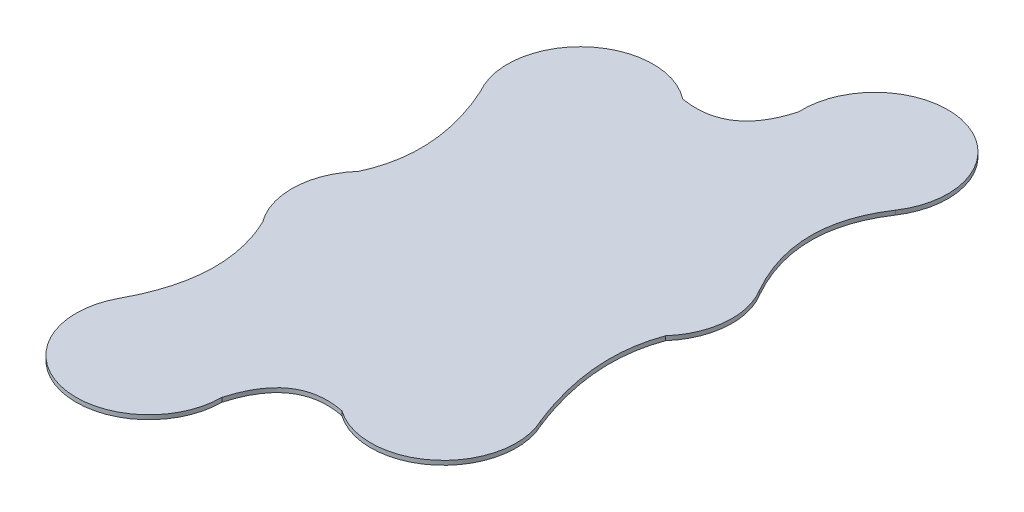
ISO-10303-21;
HEADER;
FILE_DESCRIPTION(('STEP AP214'),'2;1');
FILE_NAME('part.step','',(''),(''),'','','');
FILE_SCHEMA(('AUTOMOTIVE_DESIGN { 1 0 10303 214 1 1 1 1 }'));
ENDSEC;
DATA;
#1=APPLICATION_CONTEXT('core data for automotive mechanical design processes');
#2=APPLICATION_PROTOCOL_DEFINITION('international standard','automotive_design',2000,#1);
#3=PRODUCT_CONTEXT('',#1,'mechanical');
#4=PRODUCT('Part','Part','',(#3));
#5=PRODUCT_RELATED_PRODUCT_CATEGORY('part','',(#4));
#6=PRODUCT_DEFINITION_FORMATION('','',#4);
#7=PRODUCT_DEFINITION_CONTEXT('part definition',#1,'design');
#8=PRODUCT_DEFINITION('design','',#6,#7);
#9=PRODUCT_DEFINITION_SHAPE('','',#8);
#10=(LENGTH_UNIT() NAMED_UNIT(*) SI_UNIT(.MILLI.,.METRE.));
#11=(NAMED_UNIT(*) PLANE_ANGLE_UNIT() SI_UNIT($,.RADIAN.));
#12=(NAMED_UNIT(*) SI_UNIT($,.STERADIAN.) SOLID_ANGLE_UNIT());
#13=UNCERTAINTY_MEASURE_WITH_UNIT(LENGTH_MEASURE(1.E-05),#10,'distance_accuracy_value','');
#14=(GEOMETRIC_REPRESENTATION_CONTEXT(3) GLOBAL_UNCERTAINTY_ASSIGNED_CONTEXT((#13)) GLOBAL_UNIT_ASSIGNED_CONTEXT((#10,
#11,#12)) REPRESENTATION_CONTEXT('',''));
#15=CARTESIAN_POINT('',(0.,0.,0.));
#16=DIRECTION('',(0.,0.,1.));
#17=DIRECTION('',(1.,0.,0.));
#18=AXIS2_PLACEMENT_3D('',#15,#16,#17);
#19=CARTESIAN_POINT('',(-36.08378549757,0.5,43.4317480104097));
#20=CARTESIAN_POINT('',(-29.8316763102318,0.5,44.5112367383915));
#21=CARTESIAN_POINT('',(-28.0268993987834,0.5,37.9831700790291));
#22=B_SPLINE_CURVE_WITH_KNOTS('',2,(#19,#20,#21),.UNSPECIFIED.,.F.,.F.,(3,3),(0.,1.),.UNSPECIFIED.);
#23=DIRECTION('',(0.,-1.,0.));
#24=VECTOR('',#23,1.);
#25=SURFACE_OF_LINEAR_EXTRUSION('',#22,#24);
#26=CARTESIAN_POINT('',(-36.08378549757,0.,43.4317480104097));
#27=CARTESIAN_POINT('',(-29.8316763102318,0.,44.5112367383915));
#28=CARTESIAN_POINT('',(-28.0268993987834,0.,37.9831700790291));
#29=B_SPLINE_CURVE_WITH_KNOTS('',2,(#26,#27,#28),.UNSPECIFIED.,.F.,.F.,(3,3),(0.,1.),.UNSPECIFIED.);
#30=CARTESIAN_POINT('',(-36.08378549757,0.,43.4317480104097));
#31=VERTEX_POINT('',#30);
#32=CARTESIAN_POINT('',(-28.0268993987834,0.,37.9831700790291));
#33=VERTEX_POINT('',#32);
#34=EDGE_CURVE('E254',#31,#33,#29,.T.);
#35=ORIENTED_EDGE('',*,*,#34,.F.);
#36=DIRECTION('',(0.,-1.,0.));
#37=VECTOR('',#36,1.);
#38=CARTESIAN_POINT('',(-36.08378549757,0.5,43.4317480104097));
#39=LINE('',#38,#37);
#40=CARTESIAN_POINT('',(-36.08378549757,0.5,43.4317480104097));
#41=VERTEX_POINT('',#40);
#42=EDGE_CURVE('E11',#41,#31,#39,.T.);
#43=ORIENTED_EDGE('',*,*,#42,.F.);
#44=CARTESIAN_POINT('',(-28.0268993987834,0.5,37.9831700790291));
#45=VERTEX_POINT('',#44);
#46=EDGE_CURVE('E313',#41,#45,#22,.T.);
#47=ORIENTED_EDGE('',*,*,#46,.T.);
#48=DIRECTION('',(0.,-1.,0.));
#49=VECTOR('',#48,1.);
#50=CARTESIAN_POINT('',(-28.0268993987834,0.5,37.9831700790291));
#51=LINE('',#50,#49);
#52=EDGE_CURVE('E47',#45,#33,#51,.T.);
#53=ORIENTED_EDGE('',*,*,#52,.T.);
#54=EDGE_LOOP('',(#35,#43,#47,#53));
#55=FACE_BOUND('',#54,.T.);
#56=ADVANCED_FACE('F43',(#55),#25,.T.);
#57=CARTESIAN_POINT('',(-41.3182919912712,0.5,50.1287579228557));
#58=DIRECTION('',(0.,-1.,0.));
#59=DIRECTION('',(0.,0.,-1.));
#60=AXIS2_PLACEMENT_3D('',#57,#58,#59);
#61=CYLINDRICAL_SURFACE('',#60,8.50000000000001);
#62=CARTESIAN_POINT('',(-41.3182919912712,0.,50.1287579228557));
#63=DIRECTION('',(0.,1.,0.));
#64=DIRECTION('',(0.,0.,1.));
#65=AXIS2_PLACEMENT_3D('',#62,#63,#64);
#66=CIRCLE('',#65,8.50000000000001);
#67=CARTESIAN_POINT('',(-48.6383932433718,0.,54.449188186035));
#68=VERTEX_POINT('',#67);
#69=EDGE_CURVE('E309',#31,#68,#66,.T.);
#70=ORIENTED_EDGE('',*,*,#69,.T.);
#71=DIRECTION('',(0.,-1.,0.));
#72=VECTOR('',#71,1.);
#73=CARTESIAN_POINT('',(-48.6383932433718,0.5,54.449188186035));
#74=LINE('',#73,#72);
#75=CARTESIAN_POINT('',(-48.6383932433718,0.5,54.449188186035));
#76=VERTEX_POINT('',#75);
#77=EDGE_CURVE('E53',#76,#68,#74,.T.);
#78=ORIENTED_EDGE('',*,*,#77,.F.);
#79=CARTESIAN_POINT('',(-41.3182919912712,0.5,50.1287579228557));
#80=DIRECTION('',(0.,1.,0.));
#81=DIRECTION('',(0.,0.,1.));
#82=AXIS2_PLACEMENT_3D('',#79,#80,#81);
#83=CIRCLE('',#82,8.50000000000001);
#84=EDGE_CURVE('E159',#41,#76,#83,.T.);
#85=ORIENTED_EDGE('',*,*,#84,.F.);
#86=ORIENTED_EDGE('',*,*,#42,.T.);
#87=EDGE_LOOP('',(#70,#78,#85,#86));
#88=FACE_BOUND('',#87,.T.);
#89=ADVANCED_FACE('F174',(#88),#61,.T.);
#90=CARTESIAN_POINT('',(-47.6612581002219,0.5,69.6204206281459));
#91=CARTESIAN_POINT('',(-44.6778630402518,0.5,63.1594739411177));
#92=CARTESIAN_POINT('',(-48.6383932433718,0.5,54.449188186035));
#93=B_SPLINE_CURVE_WITH_KNOTS('',2,(#90,#91,#92),.UNSPECIFIED.,.F.,.F.,(3,3),(0.,1.),.UNSPECIFIED.);
#94=DIRECTION('',(0.,-1.,0.));
#95=VECTOR('',#94,1.);
#96=SURFACE_OF_LINEAR_EXTRUSION('',#93,#95);
#97=CARTESIAN_POINT('',(-47.6612581002219,0.,69.6204206281459));
#98=CARTESIAN_POINT('',(-44.6778630402518,0.,63.1594739411177));
#99=CARTESIAN_POINT('',(-48.6383932433718,0.,54.449188186035));
#100=B_SPLINE_CURVE_WITH_KNOTS('',2,(#97,#98,#99),.UNSPECIFIED.,.F.,.F.,(3,3),(0.,1.),.UNSPECIFIED.);
#101=CARTESIAN_POINT('',(-47.6612581002219,0.,69.6204206281459));
#102=VERTEX_POINT('',#101);
#103=EDGE_CURVE('E145',#102,#68,#100,.T.);
#104=ORIENTED_EDGE('',*,*,#103,.F.);
#105=DIRECTION('',(0.,-1.,0.));
#106=VECTOR('',#105,1.);
#107=CARTESIAN_POINT('',(-47.6612581002219,0.5,69.6204206281459));
#108=LINE('',#107,#106);
#109=CARTESIAN_POINT('',(-47.6612581002219,0.5,69.6204206281459));
#110=VERTEX_POINT('',#109);
#111=EDGE_CURVE('E139',#110,#102,#108,.T.);
#112=ORIENTED_EDGE('',*,*,#111,.F.);
#113=EDGE_CURVE('E143',#110,#76,#93,.T.);
#114=ORIENTED_EDGE('',*,*,#113,.T.);
#115=ORIENTED_EDGE('',*,*,#77,.T.);
#116=EDGE_LOOP('',(#104,#112,#114,#115));
#117=FACE_BOUND('',#116,.T.);
#118=ADVANCED_FACE('F141',(#117),#96,.T.);
#119=CARTESIAN_POINT('',(-41.3182919912712,0.5,75.2787579228557));
#120=DIRECTION('',(0.,-1.,0.));
#121=DIRECTION('',(0.,0.,-1.));
#122=AXIS2_PLACEMENT_3D('',#119,#120,#121);
#123=CYLINDRICAL_SURFACE('',#122,8.50000000000001);
#124=CARTESIAN_POINT('',(-41.3182919912712,0.,75.2787579228557));
#125=DIRECTION('',(0.,1.,0.));
#126=DIRECTION('',(0.,0.,1.));
#127=AXIS2_PLACEMENT_3D('',#124,#125,#126);
#128=CIRCLE('',#127,8.50000000000001);
#129=CARTESIAN_POINT('',(-48.1377081598603,0.,80.3527665077504));
#130=VERTEX_POINT('',#129);
#131=EDGE_CURVE('E301',#102,#130,#128,.T.);
#132=ORIENTED_EDGE('',*,*,#131,.T.);
#133=DIRECTION('',(0.,-1.,0.));
#134=VECTOR('',#133,1.);
#135=CARTESIAN_POINT('',(-48.1377081598603,0.5,80.3527665077504));
#136=LINE('',#135,#134);
#137=CARTESIAN_POINT('',(-48.1377081598603,0.5,80.3527665077504));
#138=VERTEX_POINT('',#137);
#139=EDGE_CURVE('E149',#138,#130,#136,.T.);
#140=ORIENTED_EDGE('',*,*,#139,.F.);
#141=CARTESIAN_POINT('',(-41.3182919912712,0.5,75.2787579228557));
#142=DIRECTION('',(0.,1.,0.));
#143=DIRECTION('',(0.,0.,1.));
#144=AXIS2_PLACEMENT_3D('',#141,#142,#143);
#145=CIRCLE('',#144,8.50000000000001);
#146=EDGE_CURVE('E152',#110,#138,#145,.T.);
#147=ORIENTED_EDGE('',*,*,#146,.F.);
#148=ORIENTED_EDGE('',*,*,#111,.T.);
#149=EDGE_LOOP('',(#132,#140,#147,#148));
#150=FACE_BOUND('',#149,.T.);
#151=ADVANCED_FACE('F153',(#150),#123,.T.);
#152=CARTESIAN_POINT('',(-48.7943594920591,0.5,96.3842042115466));
#153=CARTESIAN_POINT('',(-44.3787767069991,0.5,88.2223160743904));
#154=CARTESIAN_POINT('',(-48.1377081598603,0.5,80.3527665077504));
#155=B_SPLINE_CURVE_WITH_KNOTS('',2,(#152,#153,#154),.UNSPECIFIED.,.F.,.F.,(3,3),(0.,1.),.UNSPECIFIED.);
#156=DIRECTION('',(0.,-1.,0.));
#157=VECTOR('',#156,1.);
#158=SURFACE_OF_LINEAR_EXTRUSION('',#155,#157);
#159=CARTESIAN_POINT('',(-48.7943594920591,0.,96.3842042115466));
#160=CARTESIAN_POINT('',(-44.3787767069991,0.,88.2223160743904));
#161=CARTESIAN_POINT('',(-48.1377081598603,0.,80.3527665077504));
#162=B_SPLINE_CURVE_WITH_KNOTS('',2,(#159,#160,#161),.UNSPECIFIED.,.F.,.F.,(3,3),(0.,1.),.UNSPECIFIED.);
#163=CARTESIAN_POINT('',(-48.7943594920591,0.,96.3842042115466));
#164=VERTEX_POINT('',#163);
#165=EDGE_CURVE('E296',#164,#130,#162,.T.);
#166=ORIENTED_EDGE('',*,*,#165,.F.);
#167=DIRECTION('',(0.,-1.,0.));
#168=VECTOR('',#167,1.);
#169=CARTESIAN_POINT('',(-48.7943594920591,0.5,96.3842042115466));
#170=LINE('',#169,#168);
#171=CARTESIAN_POINT('',(-48.7943594920591,0.5,96.3842042115466));
#172=VERTEX_POINT('',#171);
#173=EDGE_CURVE('E317',#172,#164,#170,.T.);
#174=ORIENTED_EDGE('',*,*,#173,.F.);
#175=EDGE_CURVE('E156',#172,#138,#155,.T.);
#176=ORIENTED_EDGE('',*,*,#175,.T.);
#177=ORIENTED_EDGE('',*,*,#139,.T.);
#178=EDGE_LOOP('',(#166,#174,#176,#177));
#179=FACE_BOUND('',#178,.T.);
#180=ADVANCED_FACE('F178',(#179),#158,.T.);
#181=CARTESIAN_POINT('',(-41.3182919912712,0.5,100.428757922856));
#182=DIRECTION('',(0.,-1.,0.));
#183=DIRECTION('',(0.,0.,-1.));
#184=AXIS2_PLACEMENT_3D('',#181,#182,#183);
#185=CYLINDRICAL_SURFACE('',#184,8.50000000000001);
#186=CARTESIAN_POINT('',(-41.3182919912712,0.,100.428757922856));
#187=DIRECTION('',(0.,1.,0.));
#188=DIRECTION('',(0.,0.,1.));
#189=AXIS2_PLACEMENT_3D('',#186,#187,#188);
#190=CIRCLE('',#189,8.50000000000001);
#191=CARTESIAN_POINT('',(-32.8182919912712,0.,100.428757922856));
#192=VERTEX_POINT('',#191);
#193=EDGE_CURVE('E291',#164,#192,#190,.T.);
#194=ORIENTED_EDGE('',*,*,#193,.T.);
#195=DIRECTION('',(0.,-1.,0.));
#196=VECTOR('',#195,1.);
#197=CARTESIAN_POINT('',(-32.8182919912712,0.5,100.428757922856));
#198=LINE('',#197,#196);
#199=CARTESIAN_POINT('',(-32.8182919912712,0.5,100.428757922856));
#200=VERTEX_POINT('',#199);
#201=EDGE_CURVE('E319',#200,#192,#198,.T.);
#202=ORIENTED_EDGE('',*,*,#201,.F.);
#203=CARTESIAN_POINT('',(-41.3182919912712,0.5,100.428757922856));
#204=DIRECTION('',(0.,1.,0.));
#205=DIRECTION('',(0.,0.,1.));
#206=AXIS2_PLACEMENT_3D('',#203,#204,#205);
#207=CIRCLE('',#206,8.50000000000001);
#208=EDGE_CURVE('E188',#172,#200,#207,.T.);
#209=ORIENTED_EDGE('',*,*,#208,.F.);
#210=ORIENTED_EDGE('',*,*,#173,.T.);
#211=EDGE_LOOP('',(#194,#202,#209,#210));
#212=FACE_BOUND('',#211,.T.);
#213=ADVANCED_FACE('F181',(#212),#185,.T.);
#214=CARTESIAN_POINT('',(-32.8182919912712,0.5,100.428757922856));
#215=CARTESIAN_POINT('',(-30.8469473469866,0.5,93.4706392596609));
#216=CARTESIAN_POINT('',(-24.4457988584301,0.5,94.7935768433545));
#217=B_SPLINE_CURVE_WITH_KNOTS('',2,(#214,#215,#216),.UNSPECIFIED.,.F.,.F.,(3,3),(0.,1.),.UNSPECIFIED.);
#218=DIRECTION('',(0.,-1.,0.));
#219=VECTOR('',#218,1.);
#220=SURFACE_OF_LINEAR_EXTRUSION('',#217,#219);
#221=CARTESIAN_POINT('',(-32.8182919912712,0.,100.428757922856));
#222=CARTESIAN_POINT('',(-30.8469473469866,0.,93.4706392596609));
#223=CARTESIAN_POINT('',(-24.4457988584301,0.,94.7935768433545));
#224=B_SPLINE_CURVE_WITH_KNOTS('',2,(#221,#222,#223),.UNSPECIFIED.,.F.,.F.,(3,3),(0.,1.),.UNSPECIFIED.);
#225=CARTESIAN_POINT('',(-24.4457988584301,0.,94.7935768433545));
#226=VERTEX_POINT('',#225);
#227=EDGE_CURVE('E287',#192,#226,#224,.T.);
#228=ORIENTED_EDGE('',*,*,#227,.T.);
#229=DIRECTION('',(0.,-1.,0.));
#230=VECTOR('',#229,1.);
#231=CARTESIAN_POINT('',(-24.4457988584301,0.5,94.7935768433545));
#232=LINE('',#231,#230);
#233=CARTESIAN_POINT('',(-24.4457988584301,0.5,94.7935768433545));
#234=VERTEX_POINT('',#233);
#235=EDGE_CURVE('E322',#234,#226,#232,.T.);
#236=ORIENTED_EDGE('',*,*,#235,.F.);
#237=EDGE_CURVE('E193',#200,#234,#217,.T.);
#238=ORIENTED_EDGE('',*,*,#237,.F.);
#239=ORIENTED_EDGE('',*,*,#201,.T.);
#240=EDGE_LOOP('',(#228,#236,#238,#239));
#241=FACE_BOUND('',#240,.T.);
#242=ADVANCED_FACE('F203',(#241),#220,.F.);
#243=CARTESIAN_POINT('',(-19.5377530812712,0.5,87.8537579228557));
#244=DIRECTION('',(0.,-1.,0.));
#245=DIRECTION('',(0.,0.,-1.));
#246=AXIS2_PLACEMENT_3D('',#243,#244,#245);
#247=CYLINDRICAL_SURFACE('',#246,8.5);
#248=CARTESIAN_POINT('',(-19.5377530812712,0.,87.8537579228557));
#249=DIRECTION('',(0.,1.,0.));
#250=DIRECTION('',(0.,0.,1.));
#251=AXIS2_PLACEMENT_3D('',#248,#249,#250);
#252=CIRCLE('',#251,8.5);
#253=CARTESIAN_POINT('',(-11.8655833856098,0.,84.1948219899684));
#254=VERTEX_POINT('',#253);
#255=EDGE_CURVE('E281',#226,#254,#252,.T.);
#256=ORIENTED_EDGE('',*,*,#255,.T.);
#257=DIRECTION('',(0.,-1.,0.));
#258=VECTOR('',#257,1.);
#259=CARTESIAN_POINT('',(-11.8655833856098,0.5,84.1948219899684));
#260=LINE('',#259,#258);
#261=CARTESIAN_POINT('',(-11.8655833856098,0.5,84.1948219899684));
#262=VERTEX_POINT('',#261);
#263=EDGE_CURVE('E325',#262,#254,#260,.T.);
#264=ORIENTED_EDGE('',*,*,#263,.F.);
#265=CARTESIAN_POINT('',(-19.5377530812712,0.5,87.8537579228557));
#266=DIRECTION('',(0.,1.,0.));
#267=DIRECTION('',(0.,0.,1.));
#268=AXIS2_PLACEMENT_3D('',#265,#266,#267);
#269=CIRCLE('',#268,8.5);
#270=EDGE_CURVE('E198',#234,#262,#269,.T.);
#271=ORIENTED_EDGE('',*,*,#270,.F.);
#272=ORIENTED_EDGE('',*,*,#235,.T.);
#273=EDGE_LOOP('',(#256,#264,#271,#272));
#274=FACE_BOUND('',#273,.T.);
#275=ADVANCED_FACE('F206',(#274),#247,.T.);
#276=CARTESIAN_POINT('',(-13.1644226532565,0.5,68.3278720091222));
#277=CARTESIAN_POINT('',(-15.5868052497072,0.5,74.860973904942));
#278=CARTESIAN_POINT('',(-11.8655833856098,0.5,84.1948219899684));
#279=B_SPLINE_CURVE_WITH_KNOTS('',2,(#276,#277,#278),.UNSPECIFIED.,.F.,.F.,(3,3),(0.,1.),.UNSPECIFIED.);
#280=DIRECTION('',(0.,-1.,0.));
#281=VECTOR('',#280,1.);
#282=SURFACE_OF_LINEAR_EXTRUSION('',#279,#281);
#283=CARTESIAN_POINT('',(-13.1644226532565,0.,68.3278720091222));
#284=CARTESIAN_POINT('',(-15.5868052497072,0.,74.860973904942));
#285=CARTESIAN_POINT('',(-11.8655833856098,0.,84.1948219899684));
#286=B_SPLINE_CURVE_WITH_KNOTS('',2,(#283,#284,#285),.UNSPECIFIED.,.F.,.F.,(3,3),(0.,1.),.UNSPECIFIED.);
#287=CARTESIAN_POINT('',(-13.1644226532565,0.,68.3278720091222));
#288=VERTEX_POINT('',#287);
#289=EDGE_CURVE('E276',#288,#254,#286,.T.);
#290=ORIENTED_EDGE('',*,*,#289,.F.);
#291=DIRECTION('',(0.,-1.,0.));
#292=VECTOR('',#291,1.);
#293=CARTESIAN_POINT('',(-13.1644226532565,0.5,68.3278720091222));
#294=LINE('',#293,#292);
#295=CARTESIAN_POINT('',(-13.1644226532565,0.5,68.3278720091222));
#296=VERTEX_POINT('',#295);
#297=EDGE_CURVE('E327',#296,#288,#294,.T.);
#298=ORIENTED_EDGE('',*,*,#297,.F.);
#299=EDGE_CURVE('E217',#296,#262,#279,.T.);
#300=ORIENTED_EDGE('',*,*,#299,.T.);
#301=ORIENTED_EDGE('',*,*,#263,.T.);
#302=EDGE_LOOP('',(#290,#298,#300,#301));
#303=FACE_BOUND('',#302,.T.);
#304=ADVANCED_FACE('F210',(#303),#282,.T.);
#305=CARTESIAN_POINT('',(-19.5377530812712,0.5,62.7037579228557));
#306=DIRECTION('',(0.,-1.,0.));
#307=DIRECTION('',(0.,0.,-1.));
#308=AXIS2_PLACEMENT_3D('',#305,#306,#307);
#309=CYLINDRICAL_SURFACE('',#308,8.5);
#310=CARTESIAN_POINT('',(-19.5377530812712,0.,62.7037579228557));
#311=DIRECTION('',(0.,1.,0.));
#312=DIRECTION('',(0.,0.,1.));
#313=AXIS2_PLACEMENT_3D('',#310,#311,#312);
#314=CIRCLE('',#313,8.5);
#315=CARTESIAN_POINT('',(-12.317814786221,0.,58.2179479608013));
#316=VERTEX_POINT('',#315);
#317=EDGE_CURVE('E270',#288,#316,#314,.T.);
#318=ORIENTED_EDGE('',*,*,#317,.T.);
#319=DIRECTION('',(0.,-1.,0.));
#320=VECTOR('',#319,1.);
#321=CARTESIAN_POINT('',(-12.317814786221,0.5,58.2179479608013));
#322=LINE('',#321,#320);
#323=CARTESIAN_POINT('',(-12.317814786221,0.5,58.2179479608013));
#324=VERTEX_POINT('',#323);
#325=EDGE_CURVE('E329',#324,#316,#322,.T.);
#326=ORIENTED_EDGE('',*,*,#325,.F.);
#327=CARTESIAN_POINT('',(-19.5377530812712,0.5,62.7037579228557));
#328=DIRECTION('',(0.,1.,0.));
#329=DIRECTION('',(0.,0.,1.));
#330=AXIS2_PLACEMENT_3D('',#327,#328,#329);
#331=CIRCLE('',#330,8.5);
#332=EDGE_CURVE('E223',#296,#324,#331,.T.);
#333=ORIENTED_EDGE('',*,*,#332,.F.);
#334=ORIENTED_EDGE('',*,*,#297,.T.);
#335=EDGE_LOOP('',(#318,#326,#333,#334));
#336=FACE_BOUND('',#335,.T.);
#337=ADVANCED_FACE('F214',(#336),#309,.T.);
#338=CARTESIAN_POINT('',(-12.4542156039716,0.5,42.2520019360686));
#339=CARTESIAN_POINT('',(-17.252491186864,0.5,49.4863569040617));
#340=CARTESIAN_POINT('',(-12.317814786221,0.5,58.2179479608013));
#341=B_SPLINE_CURVE_WITH_KNOTS('',2,(#338,#339,#340),.UNSPECIFIED.,.F.,.F.,(3,3),(0.,1.),.UNSPECIFIED.);
#342=DIRECTION('',(0.,-1.,0.));
#343=VECTOR('',#342,1.);
#344=SURFACE_OF_LINEAR_EXTRUSION('',#341,#343);
#345=CARTESIAN_POINT('',(-12.4542156039716,0.,42.2520019360686));
#346=CARTESIAN_POINT('',(-17.252491186864,0.,49.4863569040617));
#347=CARTESIAN_POINT('',(-12.317814786221,0.,58.2179479608013));
#348=B_SPLINE_CURVE_WITH_KNOTS('',2,(#345,#346,#347),.UNSPECIFIED.,.F.,.F.,(3,3),(0.,1.),.UNSPECIFIED.);
#349=CARTESIAN_POINT('',(-12.4542156039716,0.,42.2520019360686));
#350=VERTEX_POINT('',#349);
#351=EDGE_CURVE('E258',#350,#316,#348,.T.);
#352=ORIENTED_EDGE('',*,*,#351,.F.);
#353=DIRECTION('',(0.,-1.,0.));
#354=VECTOR('',#353,1.);
#355=CARTESIAN_POINT('',(-12.4542156039716,0.5,42.2520019360686));
#356=LINE('',#355,#354);
#357=CARTESIAN_POINT('',(-12.4542156039716,0.5,42.2520019360686));
#358=VERTEX_POINT('',#357);
#359=EDGE_CURVE('E330',#358,#350,#356,.T.);
#360=ORIENTED_EDGE('',*,*,#359,.F.);
#361=EDGE_CURVE('E228',#358,#324,#341,.T.);
#362=ORIENTED_EDGE('',*,*,#361,.T.);
#363=ORIENTED_EDGE('',*,*,#325,.T.);
#364=EDGE_LOOP('',(#352,#360,#362,#363));
#365=FACE_BOUND('',#364,.T.);
#366=ADVANCED_FACE('F237',(#365),#344,.T.);
#367=CARTESIAN_POINT('',(-19.5377530812712,0.5,37.5537579228557));
#368=DIRECTION('',(0.,-1.,0.));
#369=DIRECTION('',(0.,0.,-1.));
#370=AXIS2_PLACEMENT_3D('',#367,#368,#369);
#371=CYLINDRICAL_SURFACE('',#370,8.5);
#372=CARTESIAN_POINT('',(-19.5377530812712,0.,37.5537579228557));
#373=DIRECTION('',(0.,1.,0.));
#374=DIRECTION('',(0.,0.,1.));
#375=AXIS2_PLACEMENT_3D('',#372,#373,#374);
#376=CIRCLE('',#375,8.5);
#377=EDGE_CURVE('E257',#350,#33,#376,.T.);
#378=ORIENTED_EDGE('',*,*,#377,.T.);
#379=ORIENTED_EDGE('',*,*,#52,.F.);
#380=CARTESIAN_POINT('',(-19.5377530812712,0.5,37.5537579228557));
#381=DIRECTION('',(0.,1.,0.));
#382=DIRECTION('',(0.,0.,1.));
#383=AXIS2_PLACEMENT_3D('',#380,#381,#382);
#384=CIRCLE('',#383,8.5);
#385=EDGE_CURVE('E113',#358,#45,#384,.T.);
#386=ORIENTED_EDGE('',*,*,#385,.F.);
#387=ORIENTED_EDGE('',*,*,#359,.T.);
#388=EDGE_LOOP('',(#378,#379,#386,#387));
#389=FACE_BOUND('',#388,.T.);
#390=ADVANCED_FACE('F239',(#389),#371,.T.);
#391=CARTESIAN_POINT('',(-30.9435093792043,0.5,42.6093478915554));
#392=DIRECTION('',(0.,-1.,0.));
#393=DIRECTION('',(0.,0.,-1.));
#394=AXIS2_PLACEMENT_3D('',#391,#392,#393);
#395=PLANE('',#394);
#396=ORIENTED_EDGE('',*,*,#46,.F.);
#397=ORIENTED_EDGE('',*,*,#84,.T.);
#398=ORIENTED_EDGE('',*,*,#113,.F.);
#399=ORIENTED_EDGE('',*,*,#146,.T.);
#400=ORIENTED_EDGE('',*,*,#175,.F.);
#401=ORIENTED_EDGE('',*,*,#208,.T.);
#402=ORIENTED_EDGE('',*,*,#237,.T.);
#403=ORIENTED_EDGE('',*,*,#270,.T.);
#404=ORIENTED_EDGE('',*,*,#299,.F.);
#405=ORIENTED_EDGE('',*,*,#332,.T.);
#406=ORIENTED_EDGE('',*,*,#361,.F.);
#407=ORIENTED_EDGE('',*,*,#385,.T.);
#408=EDGE_LOOP('',(#396,#397,#398,#399,#400,#401,#402,#403,#404,#405,#406,#407));
#409=FACE_BOUND('',#408,.T.);
#410=ADVANCED_FACE('F158',(#409),#395,.F.);
#411=CARTESIAN_POINT('',(-30.9435093792043,0.,42.6093478915554));
#412=DIRECTION('',(0.,-1.,0.));
#413=DIRECTION('',(0.,0.,-1.));
#414=AXIS2_PLACEMENT_3D('',#411,#412,#413);
#415=PLANE('',#414);
#416=ORIENTED_EDGE('',*,*,#34,.T.);
#417=ORIENTED_EDGE('',*,*,#377,.F.);
#418=ORIENTED_EDGE('',*,*,#351,.T.);
#419=ORIENTED_EDGE('',*,*,#317,.F.);
#420=ORIENTED_EDGE('',*,*,#289,.T.);
#421=ORIENTED_EDGE('',*,*,#255,.F.);
#422=ORIENTED_EDGE('',*,*,#227,.F.);
#423=ORIENTED_EDGE('',*,*,#193,.F.);
#424=ORIENTED_EDGE('',*,*,#165,.T.);
#425=ORIENTED_EDGE('',*,*,#131,.F.);
#426=ORIENTED_EDGE('',*,*,#103,.T.);
#427=ORIENTED_EDGE('',*,*,#69,.F.);
#428=EDGE_LOOP('',(#416,#417,#418,#419,#420,#421,#422,#423,#424,#425,#426,#427));
#429=FACE_BOUND('',#428,.T.);
#430=ADVANCED_FACE('F246',(#429),#415,.T.);
#431=CLOSED_SHELL('',(#56,#89,#118,#151,#180,#213,#242,#275,#304,#337,#366,#390,#410,#430));
#432=MANIFOLD_SOLID_BREP('B2',#431);
#433=ADVANCED_BREP_SHAPE_REPRESENTATION('',(#18,#432),#14);
#434=SHAPE_DEFINITION_REPRESENTATION(#9,#433);
ENDSEC;
END-ISO-10303-21;
